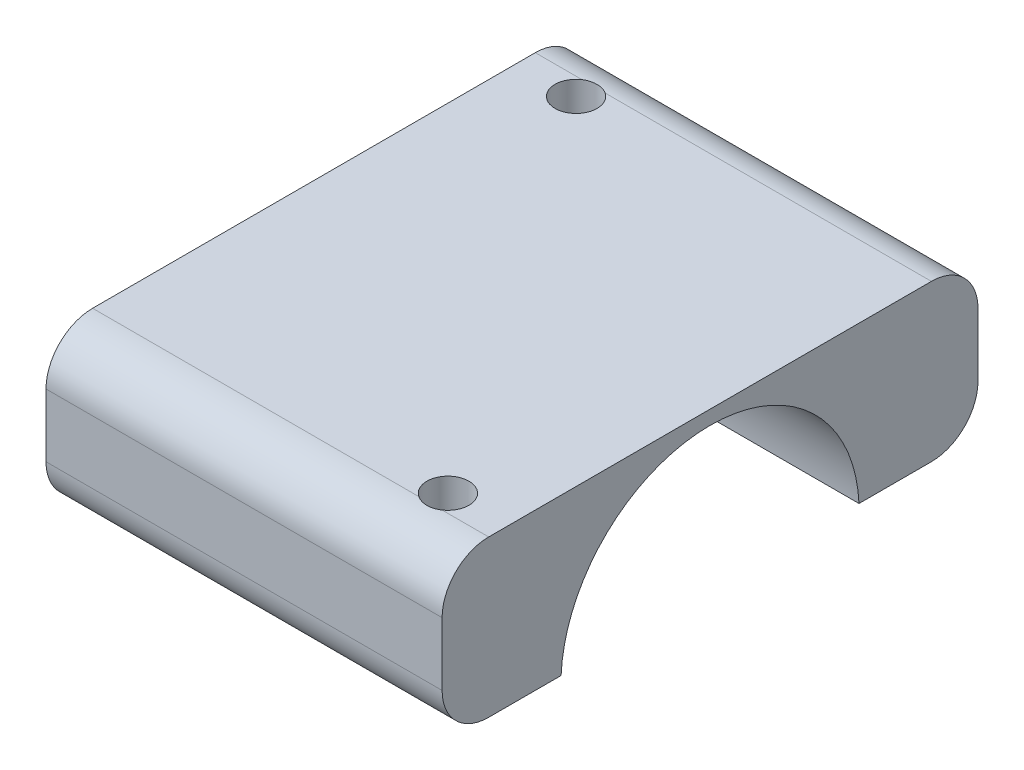
ISO-10303-21;
HEADER;
FILE_DESCRIPTION(('STEP AP214'),'2;1');
FILE_NAME('part.step','',(''),(''),'','','');
FILE_SCHEMA(('AUTOMOTIVE_DESIGN { 1 0 10303 214 1 1 1 1 }'));
ENDSEC;
DATA;
#1=APPLICATION_CONTEXT('core data for automotive mechanical design processes');
#2=APPLICATION_PROTOCOL_DEFINITION('international standard','automotive_design',2000,#1);
#3=PRODUCT_CONTEXT('',#1,'mechanical');
#4=PRODUCT('Part','Part','',(#3));
#5=PRODUCT_RELATED_PRODUCT_CATEGORY('part','',(#4));
#6=PRODUCT_DEFINITION_FORMATION('','',#4);
#7=PRODUCT_DEFINITION_CONTEXT('part definition',#1,'design');
#8=PRODUCT_DEFINITION('design','',#6,#7);
#9=PRODUCT_DEFINITION_SHAPE('','',#8);
#10=(LENGTH_UNIT() NAMED_UNIT(*) SI_UNIT(.MILLI.,.METRE.));
#11=(NAMED_UNIT(*) PLANE_ANGLE_UNIT() SI_UNIT($,.RADIAN.));
#12=(NAMED_UNIT(*) SI_UNIT($,.STERADIAN.) SOLID_ANGLE_UNIT());
#13=UNCERTAINTY_MEASURE_WITH_UNIT(LENGTH_MEASURE(1.E-05),#10,'distance_accuracy_value','');
#14=(GEOMETRIC_REPRESENTATION_CONTEXT(3) GLOBAL_UNCERTAINTY_ASSIGNED_CONTEXT((#13)) GLOBAL_UNIT_ASSIGNED_CONTEXT((#10,
#11,#12)) REPRESENTATION_CONTEXT('',''));
#15=CARTESIAN_POINT('',(0.,0.,0.));
#16=DIRECTION('',(0.,0.,1.));
#17=DIRECTION('',(1.,0.,0.));
#18=AXIS2_PLACEMENT_3D('',#15,#16,#17);
#19=CARTESIAN_POINT('',(17.,4.6,19.));
#20=DIRECTION('',(-1.,0.,0.));
#21=DIRECTION('',(0.,0.,1.));
#22=AXIS2_PLACEMENT_3D('',#19,#20,#21);
#23=CYLINDRICAL_SURFACE('',#22,4.);
#24=CARTESIAN_POINT('',(12.9949874371066,0.6,19.));
#25=CARTESIAN_POINT('',(12.9528080505859,0.600002290201008,19.0279782687762));
#26=CARTESIAN_POINT('',(12.9094699375662,0.600293109258532,19.054162436945));
#27=CARTESIAN_POINT('',(12.8207506643026,0.601246630542694,19.1027880961604));
#28=CARTESIAN_POINT('',(12.775369663094,0.601909303866988,19.1252298779078));
#29=CARTESIAN_POINT('',(12.6367080465194,0.60414515604213,19.1866521635867));
#30=CARTESIAN_POINT('',(12.5407755741953,0.605967454515857,19.2198177956695));
#31=CARTESIAN_POINT('',(12.3447108790185,0.609016111648687,19.2695824039112));
#32=CARTESIAN_POINT('',(12.2445771529861,0.610242254997947,19.2861753969049));
#33=CARTESIAN_POINT('',(12.0429252939834,0.611432977587128,19.3023260095373));
#34=CARTESIAN_POINT('',(11.9414072407699,0.611397629202322,19.3018846064864));
#35=CARTESIAN_POINT('',(11.7400149572337,0.6100843959537,19.2839916011113));
#36=CARTESIAN_POINT('',(11.6401391343925,0.608807797075412,19.266557603754));
#37=CARTESIAN_POINT('',(11.444762981889,0.605710678825216,19.2151942389305));
#38=CARTESIAN_POINT('',(11.3492591599958,0.603890602630139,19.181278297527));
#39=CARTESIAN_POINT('',(11.2134628948282,0.601745422922836,19.1197807652606));
#40=CARTESIAN_POINT('',(11.1703945654969,0.601136078493984,19.0981480345368));
#41=CARTESIAN_POINT('',(11.0862091669758,0.600264553601652,19.0515455180329));
#42=CARTESIAN_POINT('',(11.0450884560688,0.600001698383489,19.0265823227808));
#43=CARTESIAN_POINT('',(11.0050125628934,0.6,19.));
#44=B_SPLINE_CURVE_WITH_KNOTS('',3,(#24,#25,#26,#27,#28,#29,#30,#31,#32,#33,#34,#35,#36,#37,#38,
#39,#40,#41,#42,#43),.UNSPECIFIED.,.F.,.F.,(4,2,2,2,2,2,2,2,2,4),(0.,0.151748564164442,
0.30348533531734,0.606485618853393,0.90959525408197,1.21268749909945,1.51546606256915,
1.81799839737315,1.96246492195647,2.10664969408635),.UNSPECIFIED.);
#45=CARTESIAN_POINT('',(12.9949874371066,0.6,19.));
#46=VERTEX_POINT('',#45);
#47=CARTESIAN_POINT('',(11.0050125628934,0.6,19.));
#48=VERTEX_POINT('',#47);
#49=EDGE_CURVE('E136',#46,#48,#44,.T.);
#50=ORIENTED_EDGE('',*,*,#49,.F.);
#51=DIRECTION('',(-1.,0.,0.));
#52=VECTOR('',#51,1.);
#53=CARTESIAN_POINT('',(17.,0.6,19.));
#54=LINE('',#53,#52);
#55=CARTESIAN_POINT('',(17.,0.6,19.));
#56=VERTEX_POINT('',#55);
#57=EDGE_CURVE('E150',#56,#46,#54,.T.);
#58=ORIENTED_EDGE('',*,*,#57,.F.);
#59=CARTESIAN_POINT('',(17.,4.6,19.));
#60=DIRECTION('',(1.,0.,0.));
#61=DIRECTION('',(0.,0.,-1.));
#62=AXIS2_PLACEMENT_3D('',#59,#60,#61);
#63=CIRCLE('',#62,4.);
#64=CARTESIAN_POINT('',(17.,4.6,23.));
#65=VERTEX_POINT('',#64);
#66=EDGE_CURVE('E333',#65,#56,#63,.T.);
#67=ORIENTED_EDGE('',*,*,#66,.F.);
#68=DIRECTION('',(-1.,0.,0.));
#69=VECTOR('',#68,1.);
#70=CARTESIAN_POINT('',(17.,4.6,23.));
#71=LINE('',#70,#69);
#72=CARTESIAN_POINT('',(-17.,4.6,23.));
#73=VERTEX_POINT('',#72);
#74=EDGE_CURVE('E313',#65,#73,#71,.T.);
#75=ORIENTED_EDGE('',*,*,#74,.T.);
#76=CARTESIAN_POINT('',(-17.,4.6,19.));
#77=DIRECTION('',(1.,0.,0.));
#78=DIRECTION('',(0.,0.,-1.));
#79=AXIS2_PLACEMENT_3D('',#76,#77,#78);
#80=CIRCLE('',#79,4.);
#81=CARTESIAN_POINT('',(-17.,0.6,19.));
#82=VERTEX_POINT('',#81);
#83=EDGE_CURVE('E155',#73,#82,#80,.T.);
#84=ORIENTED_EDGE('',*,*,#83,.T.);
#85=EDGE_CURVE('E148',#48,#82,#54,.T.);
#86=ORIENTED_EDGE('',*,*,#85,.F.);
#87=EDGE_LOOP('',(#50,#58,#67,#75,#84,#86));
#88=FACE_BOUND('',#87,.T.);
#89=ADVANCED_FACE('F39',(#88),#23,.T.);
#90=CARTESIAN_POINT('',(17.,4.6,-19.));
#91=DIRECTION('',(-1.,0.,0.));
#92=DIRECTION('',(0.,0.,1.));
#93=AXIS2_PLACEMENT_3D('',#90,#91,#92);
#94=CYLINDRICAL_SURFACE('',#93,4.);
#95=CARTESIAN_POINT('',(-12.9949874371066,0.6,-19.));
#96=CARTESIAN_POINT('',(-12.9528080505859,0.600002290201008,-19.0279782687762));
#97=CARTESIAN_POINT('',(-12.9094699375662,0.600293109258532,-19.054162436945));
#98=CARTESIAN_POINT('',(-12.8207506643026,0.601246630542694,-19.1027880961604));
#99=CARTESIAN_POINT('',(-12.775369663094,0.601909303866988,-19.1252298779078));
#100=CARTESIAN_POINT('',(-12.6367080465194,0.60414515604213,-19.1866521635867));
#101=CARTESIAN_POINT('',(-12.5407755741953,0.605967454515857,-19.2198177956695));
#102=CARTESIAN_POINT('',(-12.3447108790185,0.609016111648687,-19.2695824039112));
#103=CARTESIAN_POINT('',(-12.2445771529861,0.610242254997947,-19.2861753969049));
#104=CARTESIAN_POINT('',(-12.0429252939834,0.611432977587128,-19.3023260095373));
#105=CARTESIAN_POINT('',(-11.9414072407699,0.611397629202322,-19.3018846064864));
#106=CARTESIAN_POINT('',(-11.7400149572337,0.6100843959537,-19.2839916011113));
#107=CARTESIAN_POINT('',(-11.6401391343925,0.608807797075412,-19.266557603754));
#108=CARTESIAN_POINT('',(-11.444762981889,0.605710678825216,-19.2151942389305));
#109=CARTESIAN_POINT('',(-11.3492591599958,0.603890602630139,-19.181278297527));
#110=CARTESIAN_POINT('',(-11.2134628948282,0.601745422922836,-19.1197807652606));
#111=CARTESIAN_POINT('',(-11.1703945654969,0.601136078493984,-19.0981480345368));
#112=CARTESIAN_POINT('',(-11.0862091669758,0.600264553601652,-19.0515455180329));
#113=CARTESIAN_POINT('',(-11.0450884560688,0.600001698383489,-19.0265823227808));
#114=CARTESIAN_POINT('',(-11.0050125628934,0.6,-19.));
#115=B_SPLINE_CURVE_WITH_KNOTS('',3,(#95,#96,#97,#98,#99,#100,#101,#102,#103,#104,#105,#106,
#107,#108,#109,#110,#111,#112,#113,#114),.UNSPECIFIED.,.F.,.F.,(4,2,2,2,2,2,2,2,2,4),(0.,
0.151748564164442,0.30348533531734,0.606485618853393,0.90959525408197,1.21268749909945,
1.51546606256915,1.81799839737315,1.96246492195647,2.10664969408635),.UNSPECIFIED.);
#116=CARTESIAN_POINT('',(-12.9949874371066,0.6,-19.));
#117=VERTEX_POINT('',#116);
#118=CARTESIAN_POINT('',(-11.0050125628934,0.6,-19.));
#119=VERTEX_POINT('',#118);
#120=EDGE_CURVE('E194',#117,#119,#115,.T.);
#121=ORIENTED_EDGE('',*,*,#120,.F.);
#122=DIRECTION('',(-1.,0.,0.));
#123=VECTOR('',#122,1.);
#124=CARTESIAN_POINT('',(17.,0.6,-19.));
#125=LINE('',#124,#123);
#126=CARTESIAN_POINT('',(-17.,0.6,-19.));
#127=VERTEX_POINT('',#126);
#128=EDGE_CURVE('E159',#117,#127,#125,.T.);
#129=ORIENTED_EDGE('',*,*,#128,.T.);
#130=CARTESIAN_POINT('',(-17.,4.6,-19.));
#131=DIRECTION('',(1.,0.,0.));
#132=DIRECTION('',(0.,0.,-1.));
#133=AXIS2_PLACEMENT_3D('',#130,#131,#132);
#134=CIRCLE('',#133,4.);
#135=CARTESIAN_POINT('',(-17.,4.6,-23.));
#136=VERTEX_POINT('',#135);
#137=EDGE_CURVE('E319',#127,#136,#134,.T.);
#138=ORIENTED_EDGE('',*,*,#137,.T.);
#139=DIRECTION('',(-1.,0.,0.));
#140=VECTOR('',#139,1.);
#141=CARTESIAN_POINT('',(17.,4.6,-23.));
#142=LINE('',#141,#140);
#143=CARTESIAN_POINT('',(17.,4.6,-23.));
#144=VERTEX_POINT('',#143);
#145=EDGE_CURVE('E293',#144,#136,#142,.T.);
#146=ORIENTED_EDGE('',*,*,#145,.F.);
#147=CARTESIAN_POINT('',(17.,4.6,-19.));
#148=DIRECTION('',(1.,0.,0.));
#149=DIRECTION('',(0.,0.,-1.));
#150=AXIS2_PLACEMENT_3D('',#147,#148,#149);
#151=CIRCLE('',#150,4.);
#152=CARTESIAN_POINT('',(17.,0.6,-19.));
#153=VERTEX_POINT('',#152);
#154=EDGE_CURVE('E291',#153,#144,#151,.T.);
#155=ORIENTED_EDGE('',*,*,#154,.F.);
#156=EDGE_CURVE('E156',#153,#119,#125,.T.);
#157=ORIENTED_EDGE('',*,*,#156,.T.);
#158=EDGE_LOOP('',(#121,#129,#138,#146,#155,#157));
#159=FACE_BOUND('',#158,.T.);
#160=ADVANCED_FACE('F205',(#159),#94,.T.);
#161=CARTESIAN_POINT('',(17.,10.009,-19.));
#162=DIRECTION('',(-1.,0.,0.));
#163=DIRECTION('',(0.,0.,1.));
#164=AXIS2_PLACEMENT_3D('',#161,#162,#163);
#165=CYLINDRICAL_SURFACE('',#164,4.);
#166=CARTESIAN_POINT('',(-11.0050125628934,14.009,-19.));
#167=CARTESIAN_POINT('',(-11.0471919494141,14.008997709799,-19.0279782687762));
#168=CARTESIAN_POINT('',(-11.0905300624338,14.0087068907415,-19.054162436945));
#169=CARTESIAN_POINT('',(-11.1792493356974,14.0077533694573,-19.1027880961604));
#170=CARTESIAN_POINT('',(-11.224630336906,14.007090696133,-19.1252298779078));
#171=CARTESIAN_POINT('',(-11.3632919534806,14.0048548439579,-19.1866521635867));
#172=CARTESIAN_POINT('',(-11.4592244258047,14.0030325454841,-19.2198177956695));
#173=CARTESIAN_POINT('',(-11.6552891209815,13.9999838883513,-19.2695824039112));
#174=CARTESIAN_POINT('',(-11.7554228470139,13.9987577450021,-19.2861753969049));
#175=CARTESIAN_POINT('',(-11.9570747060166,13.9975670224129,-19.3023260095373));
#176=CARTESIAN_POINT('',(-12.0585927592301,13.9976023707977,-19.3018846064864));
#177=CARTESIAN_POINT('',(-12.2599850427663,13.9989156040463,-19.2839916011113));
#178=CARTESIAN_POINT('',(-12.3598608656075,14.0001922029246,-19.266557603754));
#179=CARTESIAN_POINT('',(-12.555237018111,14.0032893211748,-19.2151942389305));
#180=CARTESIAN_POINT('',(-12.6507408400042,14.0051093973699,-19.181278297527));
#181=CARTESIAN_POINT('',(-12.7865371051718,14.0072545770772,-19.1197807652606));
#182=CARTESIAN_POINT('',(-12.8296054345031,14.007863921506,-19.0981480345368));
#183=CARTESIAN_POINT('',(-12.9137908330242,14.0087354463983,-19.0515455180329));
#184=CARTESIAN_POINT('',(-12.9549115439312,14.0089983016165,-19.0265823227808));
#185=CARTESIAN_POINT('',(-12.9949874371066,14.009,-19.));
#186=B_SPLINE_CURVE_WITH_KNOTS('',3,(#166,#167,#168,#169,#170,#171,#172,#173,#174,#175,#176,
#177,#178,#179,#180,#181,#182,#183,#184,#185),.UNSPECIFIED.,.F.,.F.,(4,2,2,2,2,2,2,2,2,4),(0.,
0.151748564164442,0.30348533531734,0.606485618853393,0.909595254081972,1.21268749909945,
1.51546606256915,1.81799839737315,1.96246492195647,2.10664969408635),.UNSPECIFIED.);
#187=CARTESIAN_POINT('',(-11.0050125628934,14.009,-19.));
#188=VERTEX_POINT('',#187);
#189=CARTESIAN_POINT('',(-12.9949874371066,14.009,-19.));
#190=VERTEX_POINT('',#189);
#191=EDGE_CURVE('E142',#188,#190,#186,.T.);
#192=ORIENTED_EDGE('',*,*,#191,.F.);
#193=DIRECTION('',(-1.,0.,0.));
#194=VECTOR('',#193,1.);
#195=CARTESIAN_POINT('',(17.,14.009,-19.));
#196=LINE('',#195,#194);
#197=CARTESIAN_POINT('',(17.,14.009,-19.));
#198=VERTEX_POINT('',#197);
#199=EDGE_CURVE('E343',#198,#188,#196,.T.);
#200=ORIENTED_EDGE('',*,*,#199,.F.);
#201=CARTESIAN_POINT('',(17.,10.009,-19.));
#202=DIRECTION('',(1.,0.,0.));
#203=DIRECTION('',(0.,0.,-1.));
#204=AXIS2_PLACEMENT_3D('',#201,#202,#203);
#205=CIRCLE('',#204,4.);
#206=CARTESIAN_POINT('',(17.,10.009,-23.));
#207=VERTEX_POINT('',#206);
#208=EDGE_CURVE('E299',#207,#198,#205,.T.);
#209=ORIENTED_EDGE('',*,*,#208,.F.);
#210=DIRECTION('',(-1.,0.,0.));
#211=VECTOR('',#210,1.);
#212=CARTESIAN_POINT('',(17.,10.009,-23.));
#213=LINE('',#212,#211);
#214=CARTESIAN_POINT('',(-17.,10.009,-23.));
#215=VERTEX_POINT('',#214);
#216=EDGE_CURVE('E346',#207,#215,#213,.T.);
#217=ORIENTED_EDGE('',*,*,#216,.T.);
#218=CARTESIAN_POINT('',(-17.,10.009,-19.));
#219=DIRECTION('',(1.,0.,0.));
#220=DIRECTION('',(0.,0.,-1.));
#221=AXIS2_PLACEMENT_3D('',#218,#219,#220);
#222=CIRCLE('',#221,4.);
#223=CARTESIAN_POINT('',(-17.,14.009,-19.));
#224=VERTEX_POINT('',#223);
#225=EDGE_CURVE('E323',#215,#224,#222,.T.);
#226=ORIENTED_EDGE('',*,*,#225,.T.);
#227=EDGE_CURVE('E342',#190,#224,#196,.T.);
#228=ORIENTED_EDGE('',*,*,#227,.F.);
#229=EDGE_LOOP('',(#192,#200,#209,#217,#226,#228));
#230=FACE_BOUND('',#229,.T.);
#231=ADVANCED_FACE('F201',(#230),#165,.T.);
#232=CARTESIAN_POINT('',(17.,10.009,19.));
#233=DIRECTION('',(-1.,0.,0.));
#234=DIRECTION('',(0.,0.,1.));
#235=AXIS2_PLACEMENT_3D('',#232,#233,#234);
#236=CYLINDRICAL_SURFACE('',#235,4.);
#237=CARTESIAN_POINT('',(11.0050125628934,14.009,19.));
#238=CARTESIAN_POINT('',(11.0471919494141,14.008997709799,19.0279782687762));
#239=CARTESIAN_POINT('',(11.0905300624338,14.0087068907415,19.054162436945));
#240=CARTESIAN_POINT('',(11.1792493356974,14.0077533694573,19.1027880961604));
#241=CARTESIAN_POINT('',(11.224630336906,14.007090696133,19.1252298779078));
#242=CARTESIAN_POINT('',(11.3632919534806,14.0048548439579,19.1866521635867));
#243=CARTESIAN_POINT('',(11.4592244258047,14.0030325454841,19.2198177956695));
#244=CARTESIAN_POINT('',(11.6552891209815,13.9999838883513,19.2695824039112));
#245=CARTESIAN_POINT('',(11.7554228470139,13.9987577450021,19.2861753969049));
#246=CARTESIAN_POINT('',(11.9570747060166,13.9975670224129,19.3023260095373));
#247=CARTESIAN_POINT('',(12.0585927592301,13.9976023707977,19.3018846064864));
#248=CARTESIAN_POINT('',(12.2599850427663,13.9989156040463,19.2839916011113));
#249=CARTESIAN_POINT('',(12.3598608656075,14.0001922029246,19.266557603754));
#250=CARTESIAN_POINT('',(12.555237018111,14.0032893211748,19.2151942389305));
#251=CARTESIAN_POINT('',(12.6507408400042,14.0051093973699,19.181278297527));
#252=CARTESIAN_POINT('',(12.7865371051718,14.0072545770772,19.1197807652606));
#253=CARTESIAN_POINT('',(12.8296054345031,14.007863921506,19.0981480345368));
#254=CARTESIAN_POINT('',(12.9137908330242,14.0087354463983,19.0515455180329));
#255=CARTESIAN_POINT('',(12.9549115439312,14.0089983016165,19.0265823227808));
#256=CARTESIAN_POINT('',(12.9949874371066,14.009,19.));
#257=B_SPLINE_CURVE_WITH_KNOTS('',3,(#237,#238,#239,#240,#241,#242,#243,#244,#245,#246,#247,
#248,#249,#250,#251,#252,#253,#254,#255,#256),.UNSPECIFIED.,.F.,.F.,(4,2,2,2,2,2,2,2,2,4),(0.,
0.151748564164442,0.30348533531734,0.606485618853393,0.909595254081972,1.21268749909945,
1.51546606256915,1.81799839737315,1.96246492195647,2.10664969408635),.UNSPECIFIED.);
#258=CARTESIAN_POINT('',(11.0050125628934,14.009,19.));
#259=VERTEX_POINT('',#258);
#260=CARTESIAN_POINT('',(12.9949874371066,14.009,19.));
#261=VERTEX_POINT('',#260);
#262=EDGE_CURVE('E47',#259,#261,#257,.T.);
#263=ORIENTED_EDGE('',*,*,#262,.F.);
#264=DIRECTION('',(-1.,0.,0.));
#265=VECTOR('',#264,1.);
#266=CARTESIAN_POINT('',(17.,14.009,19.));
#267=LINE('',#266,#265);
#268=CARTESIAN_POINT('',(-17.,14.009,19.));
#269=VERTEX_POINT('',#268);
#270=EDGE_CURVE('E338',#259,#269,#267,.T.);
#271=ORIENTED_EDGE('',*,*,#270,.T.);
#272=CARTESIAN_POINT('',(-17.,10.009,19.));
#273=DIRECTION('',(1.,0.,0.));
#274=DIRECTION('',(0.,0.,-1.));
#275=AXIS2_PLACEMENT_3D('',#272,#273,#274);
#276=CIRCLE('',#275,4.);
#277=CARTESIAN_POINT('',(-17.,10.009,23.));
#278=VERTEX_POINT('',#277);
#279=EDGE_CURVE('E329',#269,#278,#276,.T.);
#280=ORIENTED_EDGE('',*,*,#279,.T.);
#281=DIRECTION('',(-1.,0.,0.));
#282=VECTOR('',#281,1.);
#283=CARTESIAN_POINT('',(17.,10.009,23.));
#284=LINE('',#283,#282);
#285=CARTESIAN_POINT('',(17.,10.009,23.));
#286=VERTEX_POINT('',#285);
#287=EDGE_CURVE('E335',#286,#278,#284,.T.);
#288=ORIENTED_EDGE('',*,*,#287,.F.);
#289=CARTESIAN_POINT('',(17.,10.009,19.));
#290=DIRECTION('',(1.,0.,0.));
#291=DIRECTION('',(0.,0.,-1.));
#292=AXIS2_PLACEMENT_3D('',#289,#290,#291);
#293=CIRCLE('',#292,4.);
#294=CARTESIAN_POINT('',(17.,14.009,19.));
#295=VERTEX_POINT('',#294);
#296=EDGE_CURVE('E309',#295,#286,#293,.T.);
#297=ORIENTED_EDGE('',*,*,#296,.F.);
#298=EDGE_CURVE('E339',#295,#261,#267,.T.);
#299=ORIENTED_EDGE('',*,*,#298,.T.);
#300=EDGE_LOOP('',(#263,#271,#280,#288,#297,#299));
#301=FACE_BOUND('',#300,.T.);
#302=ADVANCED_FACE('F168',(#301),#236,.T.);
#303=CARTESIAN_POINT('',(17.,0.6,19.));
#304=DIRECTION('',(0.,1.,0.));
#305=DIRECTION('',(0.,0.,1.));
#306=AXIS2_PLACEMENT_3D('',#303,#304,#305);
#307=PLANE('',#306);
#308=CARTESIAN_POINT('',(12.,0.6,17.5));
#309=DIRECTION('',(0.,1.,0.));
#310=DIRECTION('',(0.,0.,1.));
#311=AXIS2_PLACEMENT_3D('',#308,#309,#310);
#312=CIRCLE('',#311,1.8);
#313=EDGE_CURVE('E53',#46,#48,#312,.T.);
#314=ORIENTED_EDGE('',*,*,#313,.T.);
#315=ORIENTED_EDGE('',*,*,#85,.T.);
#316=DIRECTION('',(0.,0.,-1.));
#317=VECTOR('',#316,1.);
#318=CARTESIAN_POINT('',(-17.,0.6,19.));
#319=LINE('',#318,#317);
#320=CARTESIAN_POINT('',(-17.,0.6,12.7859297667397));
#321=VERTEX_POINT('',#320);
#322=EDGE_CURVE('E317',#82,#321,#319,.T.);
#323=ORIENTED_EDGE('',*,*,#322,.T.);
#324=DIRECTION('',(1.,0.,0.));
#325=VECTOR('',#324,1.);
#326=CARTESIAN_POINT('',(-17.,0.6,12.7859297667397));
#327=LINE('',#326,#325);
#328=CARTESIAN_POINT('',(17.,0.6,12.7859297667397));
#329=VERTEX_POINT('',#328);
#330=EDGE_CURVE('E316',#321,#329,#327,.T.);
#331=ORIENTED_EDGE('',*,*,#330,.T.);
#332=DIRECTION('',(0.,0.,-1.));
#333=VECTOR('',#332,1.);
#334=CARTESIAN_POINT('',(17.,0.6,19.));
#335=LINE('',#334,#333);
#336=EDGE_CURVE('E297',#56,#329,#335,.T.);
#337=ORIENTED_EDGE('',*,*,#336,.F.);
#338=ORIENTED_EDGE('',*,*,#57,.T.);
#339=EDGE_LOOP('',(#314,#315,#323,#331,#337,#338));
#340=FACE_BOUND('',#339,.T.);
#341=ADVANCED_FACE('F146',(#340),#307,.F.);
#342=CARTESIAN_POINT('',(-12.,0.6,-17.5));
#343=DIRECTION('',(0.,1.,0.));
#344=DIRECTION('',(0.,0.,1.));
#345=AXIS2_PLACEMENT_3D('',#342,#343,#344);
#346=CIRCLE('',#345,1.8);
#347=EDGE_CURVE('E60',#117,#119,#346,.T.);
#348=ORIENTED_EDGE('',*,*,#347,.T.);
#349=ORIENTED_EDGE('',*,*,#156,.F.);
#350=CARTESIAN_POINT('',(17.,0.6,-12.7859297667397));
#351=VERTEX_POINT('',#350);
#352=EDGE_CURVE('E302',#351,#153,#335,.T.);
#353=ORIENTED_EDGE('',*,*,#352,.F.);
#354=DIRECTION('',(1.,0.,0.));
#355=VECTOR('',#354,1.);
#356=CARTESIAN_POINT('',(-17.,0.6,-12.7859297667397));
#357=LINE('',#356,#355);
#358=CARTESIAN_POINT('',(-17.,0.6,-12.7859297667397));
#359=VERTEX_POINT('',#358);
#360=EDGE_CURVE('E352',#351,#359,#357,.F.);
#361=ORIENTED_EDGE('',*,*,#360,.T.);
#362=EDGE_CURVE('E315',#359,#127,#319,.T.);
#363=ORIENTED_EDGE('',*,*,#362,.T.);
#364=ORIENTED_EDGE('',*,*,#128,.F.);
#365=EDGE_LOOP('',(#348,#349,#353,#361,#363,#364));
#366=FACE_BOUND('',#365,.T.);
#367=ADVANCED_FACE('F210',(#366),#307,.F.);
#368=CARTESIAN_POINT('',(17.,4.6,-23.));
#369=DIRECTION('',(0.,0.,1.));
#370=DIRECTION('',(1.,0.,0.));
#371=AXIS2_PLACEMENT_3D('',#368,#369,#370);
#372=PLANE('',#371);
#373=DIRECTION('',(0.,1.,0.));
#374=VECTOR('',#373,1.);
#375=CARTESIAN_POINT('',(-17.,4.6,-23.));
#376=LINE('',#375,#374);
#377=EDGE_CURVE('E321',#136,#215,#376,.T.);
#378=ORIENTED_EDGE('',*,*,#377,.T.);
#379=ORIENTED_EDGE('',*,*,#216,.F.);
#380=DIRECTION('',(0.,1.,0.));
#381=VECTOR('',#380,1.);
#382=CARTESIAN_POINT('',(17.,4.6,-23.));
#383=LINE('',#382,#381);
#384=EDGE_CURVE('E296',#144,#207,#383,.T.);
#385=ORIENTED_EDGE('',*,*,#384,.F.);
#386=ORIENTED_EDGE('',*,*,#145,.T.);
#387=EDGE_LOOP('',(#378,#379,#385,#386));
#388=FACE_BOUND('',#387,.T.);
#389=ADVANCED_FACE('F208',(#388),#372,.F.);
#390=CARTESIAN_POINT('',(17.,14.009,-19.));
#391=DIRECTION('',(0.,-1.,0.));
#392=DIRECTION('',(0.,0.,-1.));
#393=AXIS2_PLACEMENT_3D('',#390,#391,#392);
#394=PLANE('',#393);
#395=CARTESIAN_POINT('',(12.,14.009,17.5));
#396=DIRECTION('',(0.,-1.,0.));
#397=DIRECTION('',(0.,0.,-1.));
#398=AXIS2_PLACEMENT_3D('',#395,#396,#397);
#399=CIRCLE('',#398,1.8);
#400=EDGE_CURVE('E143',#261,#259,#399,.F.);
#401=ORIENTED_EDGE('',*,*,#400,.F.);
#402=ORIENTED_EDGE('',*,*,#298,.F.);
#403=DIRECTION('',(0.,0.,1.));
#404=VECTOR('',#403,1.);
#405=CARTESIAN_POINT('',(17.,14.009,-19.));
#406=LINE('',#405,#404);
#407=EDGE_CURVE('E307',#198,#295,#406,.T.);
#408=ORIENTED_EDGE('',*,*,#407,.F.);
#409=ORIENTED_EDGE('',*,*,#199,.T.);
#410=CARTESIAN_POINT('',(-12.,14.009,-17.5));
#411=DIRECTION('',(0.,-1.,0.));
#412=DIRECTION('',(0.,0.,-1.));
#413=AXIS2_PLACEMENT_3D('',#410,#411,#412);
#414=CIRCLE('',#413,1.8);
#415=EDGE_CURVE('E11',#190,#188,#414,.F.);
#416=ORIENTED_EDGE('',*,*,#415,.F.);
#417=ORIENTED_EDGE('',*,*,#227,.T.);
#418=DIRECTION('',(0.,0.,1.));
#419=VECTOR('',#418,1.);
#420=CARTESIAN_POINT('',(-17.,14.009,-19.));
#421=LINE('',#420,#419);
#422=EDGE_CURVE('E326',#224,#269,#421,.T.);
#423=ORIENTED_EDGE('',*,*,#422,.T.);
#424=ORIENTED_EDGE('',*,*,#270,.F.);
#425=EDGE_LOOP('',(#401,#402,#408,#409,#416,#417,#423,#424));
#426=FACE_BOUND('',#425,.T.);
#427=ADVANCED_FACE('F207',(#426),#394,.F.);
#428=CARTESIAN_POINT('',(17.,10.009,23.));
#429=DIRECTION('',(0.,0.,-1.));
#430=DIRECTION('',(-1.,0.,0.));
#431=AXIS2_PLACEMENT_3D('',#428,#429,#430);
#432=PLANE('',#431);
#433=DIRECTION('',(0.,-1.,0.));
#434=VECTOR('',#433,1.);
#435=CARTESIAN_POINT('',(-17.,10.009,23.));
#436=LINE('',#435,#434);
#437=EDGE_CURVE('E331',#278,#73,#436,.T.);
#438=ORIENTED_EDGE('',*,*,#437,.T.);
#439=ORIENTED_EDGE('',*,*,#74,.F.);
#440=DIRECTION('',(0.,-1.,0.));
#441=VECTOR('',#440,1.);
#442=CARTESIAN_POINT('',(17.,10.009,23.));
#443=LINE('',#442,#441);
#444=EDGE_CURVE('E311',#286,#65,#443,.T.);
#445=ORIENTED_EDGE('',*,*,#444,.F.);
#446=ORIENTED_EDGE('',*,*,#287,.T.);
#447=EDGE_LOOP('',(#438,#439,#445,#446));
#448=FACE_BOUND('',#447,.T.);
#449=ADVANCED_FACE('F376',(#448),#432,.F.);
#450=CARTESIAN_POINT('',(17.,4.6,19.));
#451=DIRECTION('',(1.,0.,0.));
#452=DIRECTION('',(0.,0.,-1.));
#453=AXIS2_PLACEMENT_3D('',#450,#451,#452);
#454=PLANE('',#453);
#455=CARTESIAN_POINT('',(17.,0.,0.));
#456=DIRECTION('',(1.,0.,0.));
#457=DIRECTION('',(0.,0.,-1.));
#458=AXIS2_PLACEMENT_3D('',#455,#456,#457);
#459=CIRCLE('',#458,12.8);
#460=EDGE_CURVE('E285',#351,#329,#459,.T.);
#461=ORIENTED_EDGE('',*,*,#460,.F.);
#462=ORIENTED_EDGE('',*,*,#352,.T.);
#463=ORIENTED_EDGE('',*,*,#154,.T.);
#464=ORIENTED_EDGE('',*,*,#384,.T.);
#465=ORIENTED_EDGE('',*,*,#208,.T.);
#466=ORIENTED_EDGE('',*,*,#407,.T.);
#467=ORIENTED_EDGE('',*,*,#296,.T.);
#468=ORIENTED_EDGE('',*,*,#444,.T.);
#469=ORIENTED_EDGE('',*,*,#66,.T.);
#470=ORIENTED_EDGE('',*,*,#336,.T.);
#471=EDGE_LOOP('',(#461,#462,#463,#464,#465,#466,#467,#468,#469,#470));
#472=FACE_BOUND('',#471,.T.);
#473=ADVANCED_FACE('F363',(#472),#454,.T.);
#474=CARTESIAN_POINT('',(-17.,4.6,19.));
#475=DIRECTION('',(1.,0.,0.));
#476=DIRECTION('',(0.,0.,-1.));
#477=AXIS2_PLACEMENT_3D('',#474,#475,#476);
#478=PLANE('',#477);
#479=ORIENTED_EDGE('',*,*,#362,.F.);
#480=CARTESIAN_POINT('',(-17.,0.,0.));
#481=DIRECTION('',(1.,0.,0.));
#482=DIRECTION('',(0.,0.,-1.));
#483=AXIS2_PLACEMENT_3D('',#480,#481,#482);
#484=CIRCLE('',#483,12.8);
#485=EDGE_CURVE('E383',#359,#321,#484,.T.);
#486=ORIENTED_EDGE('',*,*,#485,.T.);
#487=ORIENTED_EDGE('',*,*,#322,.F.);
#488=ORIENTED_EDGE('',*,*,#83,.F.);
#489=ORIENTED_EDGE('',*,*,#437,.F.);
#490=ORIENTED_EDGE('',*,*,#279,.F.);
#491=ORIENTED_EDGE('',*,*,#422,.F.);
#492=ORIENTED_EDGE('',*,*,#225,.F.);
#493=ORIENTED_EDGE('',*,*,#377,.F.);
#494=ORIENTED_EDGE('',*,*,#137,.F.);
#495=EDGE_LOOP('',(#479,#486,#487,#488,#489,#490,#491,#492,#493,#494));
#496=FACE_BOUND('',#495,.T.);
#497=ADVANCED_FACE('F254',(#496),#478,.F.);
#498=CARTESIAN_POINT('',(-17.,0.,0.));
#499=DIRECTION('',(1.,0.,0.));
#500=DIRECTION('',(0.,0.,-1.));
#501=AXIS2_PLACEMENT_3D('',#498,#499,#500);
#502=CYLINDRICAL_SURFACE('',#501,12.8);
#503=ORIENTED_EDGE('',*,*,#485,.F.);
#504=ORIENTED_EDGE('',*,*,#360,.F.);
#505=ORIENTED_EDGE('',*,*,#460,.T.);
#506=ORIENTED_EDGE('',*,*,#330,.F.);
#507=EDGE_LOOP('',(#503,#504,#505,#506));
#508=FACE_BOUND('',#507,.T.);
#509=ADVANCED_FACE('F176',(#508),#502,.F.);
#510=CARTESIAN_POINT('',(12.,14.609,17.5));
#511=DIRECTION('',(0.,-1.,0.));
#512=DIRECTION('',(0.,0.,-1.));
#513=AXIS2_PLACEMENT_3D('',#510,#511,#512);
#514=CYLINDRICAL_SURFACE('',#513,1.8);
#515=ORIENTED_EDGE('',*,*,#400,.T.);
#516=ORIENTED_EDGE('',*,*,#262,.T.);
#517=EDGE_LOOP('',(#515,#516));
#518=FACE_BOUND('',#517,.T.);
#519=ORIENTED_EDGE('',*,*,#49,.T.);
#520=ORIENTED_EDGE('',*,*,#313,.F.);
#521=EDGE_LOOP('',(#519,#520));
#522=FACE_BOUND('',#521,.T.);
#523=ADVANCED_FACE('F137',(#518,#522),#514,.F.);
#524=CARTESIAN_POINT('',(-12.,14.609,-17.5));
#525=DIRECTION('',(0.,-1.,0.));
#526=DIRECTION('',(0.,0.,-1.));
#527=AXIS2_PLACEMENT_3D('',#524,#525,#526);
#528=CYLINDRICAL_SURFACE('',#527,1.8);
#529=ORIENTED_EDGE('',*,*,#191,.T.);
#530=ORIENTED_EDGE('',*,*,#415,.T.);
#531=EDGE_LOOP('',(#529,#530));
#532=FACE_BOUND('',#531,.T.);
#533=ORIENTED_EDGE('',*,*,#120,.T.);
#534=ORIENTED_EDGE('',*,*,#347,.F.);
#535=EDGE_LOOP('',(#533,#534));
#536=FACE_BOUND('',#535,.T.);
#537=ADVANCED_FACE('F175',(#532,#536),#528,.F.);
#538=CLOSED_SHELL('',(#89,#160,#231,#302,#341,#367,#389,#427,#449,#473,#497,#509,#523,#537));
#539=MANIFOLD_SOLID_BREP('B2',#538);
#540=ADVANCED_BREP_SHAPE_REPRESENTATION('',(#18,#539),#14);
#541=SHAPE_DEFINITION_REPRESENTATION(#9,#540);
ENDSEC;
END-ISO-10303-21;
